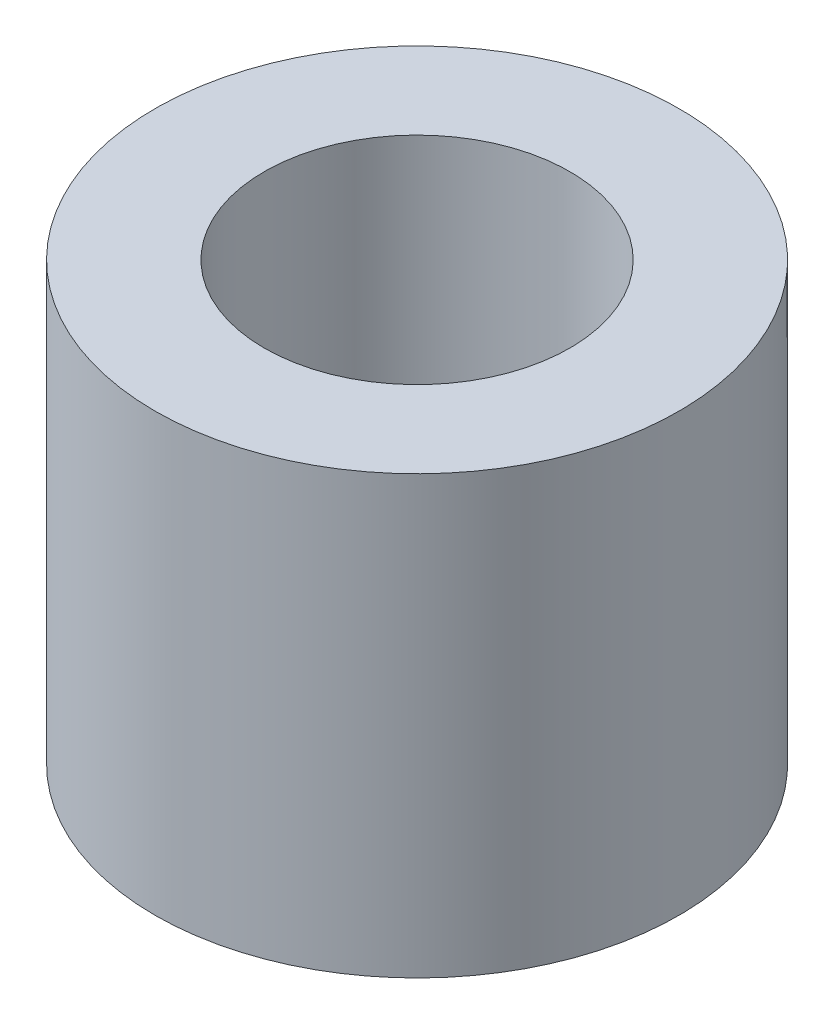
ISO-10303-21;
HEADER;
FILE_DESCRIPTION(('STEP AP214'),'2;1');
FILE_NAME('part.step','',(''),(''),'','','');
FILE_SCHEMA(('AUTOMOTIVE_DESIGN { 1 0 10303 214 1 1 1 1 }'));
ENDSEC;
DATA;
#1=APPLICATION_CONTEXT('core data for automotive mechanical design processes');
#2=APPLICATION_PROTOCOL_DEFINITION('international standard','automotive_design',2000,#1);
#3=PRODUCT_CONTEXT('',#1,'mechanical');
#4=PRODUCT('Part','Part','',(#3));
#5=PRODUCT_RELATED_PRODUCT_CATEGORY('part','',(#4));
#6=PRODUCT_DEFINITION_FORMATION('','',#4);
#7=PRODUCT_DEFINITION_CONTEXT('part definition',#1,'design');
#8=PRODUCT_DEFINITION('design','',#6,#7);
#9=PRODUCT_DEFINITION_SHAPE('','',#8);
#10=(LENGTH_UNIT() NAMED_UNIT(*) SI_UNIT(.MILLI.,.METRE.));
#11=(NAMED_UNIT(*) PLANE_ANGLE_UNIT() SI_UNIT($,.RADIAN.));
#12=(NAMED_UNIT(*) SI_UNIT($,.STERADIAN.) SOLID_ANGLE_UNIT());
#13=UNCERTAINTY_MEASURE_WITH_UNIT(LENGTH_MEASURE(1.E-05),#10,'distance_accuracy_value','');
#14=(GEOMETRIC_REPRESENTATION_CONTEXT(3) GLOBAL_UNCERTAINTY_ASSIGNED_CONTEXT((#13)) GLOBAL_UNIT_ASSIGNED_CONTEXT((#10,
#11,#12)) REPRESENTATION_CONTEXT('',''));
#15=CARTESIAN_POINT('',(0.,0.,0.));
#16=DIRECTION('',(0.,0.,1.));
#17=DIRECTION('',(1.,0.,0.));
#18=AXIS2_PLACEMENT_3D('',#15,#16,#17);
#19=CARTESIAN_POINT('',(0.,3.,0.));
#20=DIRECTION('',(0.,1.,0.));
#21=DIRECTION('',(0.,0.,1.));
#22=AXIS2_PLACEMENT_3D('',#19,#20,#21);
#23=PLANE('',#22);
#24=CARTESIAN_POINT('',(0.,3.,0.));
#25=DIRECTION('',(0.,1.,0.));
#26=DIRECTION('',(0.,0.,1.));
#27=AXIS2_PLACEMENT_3D('',#24,#25,#26);
#28=CIRCLE('',#27,3.6);
#29=CARTESIAN_POINT('',(0.,3.,3.6));
#30=VERTEX_POINT('',#29);
#31=EDGE_CURVE('E10',#30,#30,#28,.T.);
#32=ORIENTED_EDGE('',*,*,#31,.T.);
#33=EDGE_LOOP('',(#32));
#34=FACE_BOUND('',#33,.T.);
#35=CARTESIAN_POINT('',(0.,3.,0.));
#36=DIRECTION('',(0.,1.,0.));
#37=DIRECTION('',(0.,0.,1.));
#38=AXIS2_PLACEMENT_3D('',#35,#36,#37);
#39=CIRCLE('',#38,2.1);
#40=CARTESIAN_POINT('',(0.,3.,2.1));
#41=VERTEX_POINT('',#40);
#42=EDGE_CURVE('E43',#41,#41,#39,.T.);
#43=ORIENTED_EDGE('',*,*,#42,.F.);
#44=EDGE_LOOP('',(#43));
#45=FACE_BOUND('',#44,.T.);
#46=ADVANCED_FACE('F32',(#34,#45),#23,.T.);
#47=CARTESIAN_POINT('',(0.,-3.,0.));
#48=DIRECTION('',(0.,1.,0.));
#49=DIRECTION('',(0.,0.,1.));
#50=AXIS2_PLACEMENT_3D('',#47,#48,#49);
#51=PLANE('',#50);
#52=CARTESIAN_POINT('',(0.,-3.,0.));
#53=DIRECTION('',(0.,1.,0.));
#54=DIRECTION('',(0.,0.,1.));
#55=AXIS2_PLACEMENT_3D('',#52,#53,#54);
#56=CIRCLE('',#55,3.6);
#57=CARTESIAN_POINT('',(0.,-3.,3.6));
#58=VERTEX_POINT('',#57);
#59=EDGE_CURVE('E36',#58,#58,#56,.T.);
#60=ORIENTED_EDGE('',*,*,#59,.F.);
#61=EDGE_LOOP('',(#60));
#62=FACE_BOUND('',#61,.T.);
#63=CARTESIAN_POINT('',(0.,-3.,0.));
#64=DIRECTION('',(0.,1.,0.));
#65=DIRECTION('',(0.,0.,1.));
#66=AXIS2_PLACEMENT_3D('',#63,#64,#65);
#67=CIRCLE('',#66,2.1);
#68=CARTESIAN_POINT('',(0.,-3.,2.1));
#69=VERTEX_POINT('',#68);
#70=EDGE_CURVE('E45',#69,#69,#67,.T.);
#71=ORIENTED_EDGE('',*,*,#70,.T.);
#72=EDGE_LOOP('',(#71));
#73=FACE_BOUND('',#72,.T.);
#74=ADVANCED_FACE('F55',(#62,#73),#51,.F.);
#75=CARTESIAN_POINT('',(0.,3.,0.));
#76=DIRECTION('',(0.,-1.,0.));
#77=DIRECTION('',(0.,0.,-1.));
#78=AXIS2_PLACEMENT_3D('',#75,#76,#77);
#79=CYLINDRICAL_SURFACE('',#78,3.6);
#80=ORIENTED_EDGE('',*,*,#31,.F.);
#81=EDGE_LOOP('',(#80));
#82=FACE_BOUND('',#81,.T.);
#83=ORIENTED_EDGE('',*,*,#59,.T.);
#84=EDGE_LOOP('',(#83));
#85=FACE_BOUND('',#84,.T.);
#86=ADVANCED_FACE('F34',(#82,#85),#79,.T.);
#87=CARTESIAN_POINT('',(0.,3.,0.));
#88=DIRECTION('',(0.,-1.,0.));
#89=DIRECTION('',(0.,0.,-1.));
#90=AXIS2_PLACEMENT_3D('',#87,#88,#89);
#91=CYLINDRICAL_SURFACE('',#90,2.1);
#92=ORIENTED_EDGE('',*,*,#42,.T.);
#93=EDGE_LOOP('',(#92));
#94=FACE_BOUND('',#93,.T.);
#95=ORIENTED_EDGE('',*,*,#70,.F.);
#96=EDGE_LOOP('',(#95));
#97=FACE_BOUND('',#96,.T.);
#98=ADVANCED_FACE('F51',(#94,#97),#91,.F.);
#99=CLOSED_SHELL('',(#46,#74,#86,#98));
#100=MANIFOLD_SOLID_BREP('B2',#99);
#101=ADVANCED_BREP_SHAPE_REPRESENTATION('',(#18,#100),#14);
#102=SHAPE_DEFINITION_REPRESENTATION(#9,#101);
ENDSEC;
END-ISO-10303-21;
